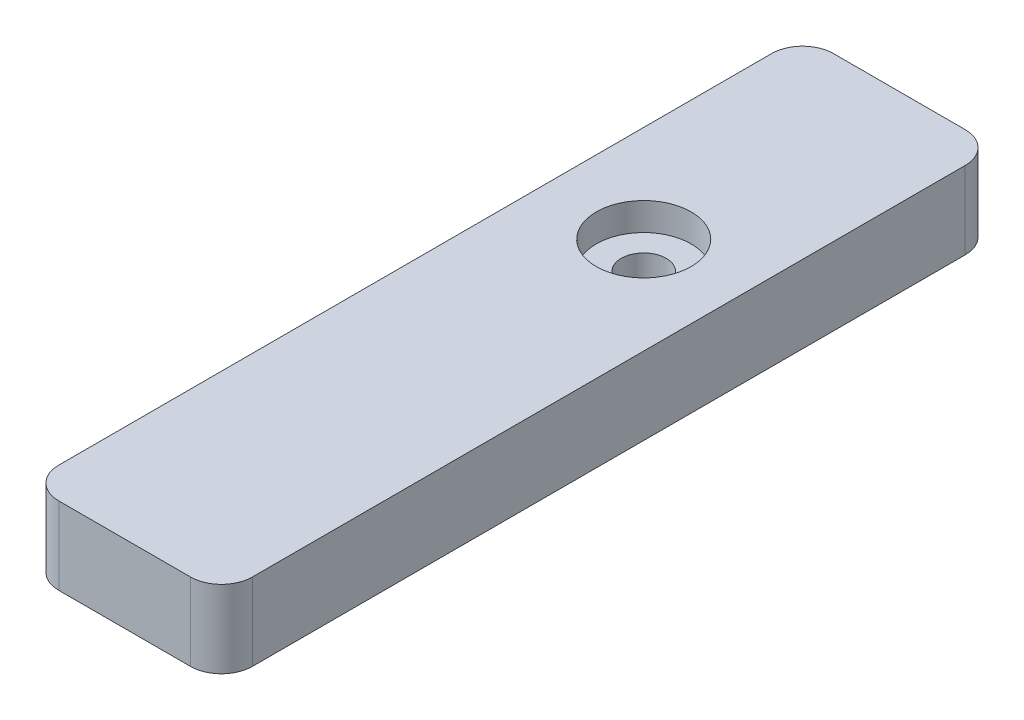
ISO-10303-21;
HEADER;
FILE_DESCRIPTION(('STEP AP214'),'2;1');
FILE_NAME('part.step','',(''),(''),'','','');
FILE_SCHEMA(('AUTOMOTIVE_DESIGN { 1 0 10303 214 1 1 1 1 }'));
ENDSEC;
DATA;
#1=APPLICATION_CONTEXT('core data for automotive mechanical design processes');
#2=APPLICATION_PROTOCOL_DEFINITION('international standard','automotive_design',2000,#1);
#3=PRODUCT_CONTEXT('',#1,'mechanical');
#4=PRODUCT('Part','Part','',(#3));
#5=PRODUCT_RELATED_PRODUCT_CATEGORY('part','',(#4));
#6=PRODUCT_DEFINITION_FORMATION('','',#4);
#7=PRODUCT_DEFINITION_CONTEXT('part definition',#1,'design');
#8=PRODUCT_DEFINITION('design','',#6,#7);
#9=PRODUCT_DEFINITION_SHAPE('','',#8);
#10=(LENGTH_UNIT() NAMED_UNIT(*) SI_UNIT(.MILLI.,.METRE.));
#11=(NAMED_UNIT(*) PLANE_ANGLE_UNIT() SI_UNIT($,.RADIAN.));
#12=(NAMED_UNIT(*) SI_UNIT($,.STERADIAN.) SOLID_ANGLE_UNIT());
#13=UNCERTAINTY_MEASURE_WITH_UNIT(LENGTH_MEASURE(1.E-05),#10,'distance_accuracy_value','');
#14=(GEOMETRIC_REPRESENTATION_CONTEXT(3) GLOBAL_UNCERTAINTY_ASSIGNED_CONTEXT((#13)) GLOBAL_UNIT_ASSIGNED_CONTEXT((#10,
#11,#12)) REPRESENTATION_CONTEXT('',''));
#15=CARTESIAN_POINT('',(0.,0.,0.));
#16=DIRECTION('',(0.,0.,1.));
#17=DIRECTION('',(1.,0.,0.));
#18=AXIS2_PLACEMENT_3D('',#15,#16,#17);
#19=CARTESIAN_POINT('',(0.,10.,0.));
#20=DIRECTION('',(1.,0.,0.));
#21=DIRECTION('',(0.,0.,-1.));
#22=AXIS2_PLACEMENT_3D('',#19,#20,#21);
#23=PLANE('',#22);
#24=DIRECTION('',(0.,0.,1.));
#25=VECTOR('',#24,1.);
#26=CARTESIAN_POINT('',(0.,0.,0.));
#27=LINE('',#26,#25);
#28=CARTESIAN_POINT('',(0.,0.,-96.));
#29=VERTEX_POINT('',#28);
#30=CARTESIAN_POINT('',(0.,0.,-4.));
#31=VERTEX_POINT('',#30);
#32=EDGE_CURVE('E132',#29,#31,#27,.T.);
#33=ORIENTED_EDGE('',*,*,#32,.T.);
#34=DIRECTION('',(0.,-1.,0.));
#35=VECTOR('',#34,1.);
#36=CARTESIAN_POINT('',(0.,10.,-4.));
#37=LINE('',#36,#35);
#38=CARTESIAN_POINT('',(0.,10.,-4.));
#39=VERTEX_POINT('',#38);
#40=EDGE_CURVE('E155',#31,#39,#37,.F.);
#41=ORIENTED_EDGE('',*,*,#40,.T.);
#42=DIRECTION('',(0.,0.,1.));
#43=VECTOR('',#42,1.);
#44=CARTESIAN_POINT('',(0.,10.,0.));
#45=LINE('',#44,#43);
#46=CARTESIAN_POINT('',(0.,10.,-96.));
#47=VERTEX_POINT('',#46);
#48=EDGE_CURVE('E130',#47,#39,#45,.T.);
#49=ORIENTED_EDGE('',*,*,#48,.F.);
#50=DIRECTION('',(0.,-1.,0.));
#51=VECTOR('',#50,1.);
#52=CARTESIAN_POINT('',(0.,10.,-96.));
#53=LINE('',#52,#51);
#54=EDGE_CURVE('E152',#47,#29,#53,.T.);
#55=ORIENTED_EDGE('',*,*,#54,.T.);
#56=EDGE_LOOP('',(#33,#41,#49,#55));
#57=FACE_BOUND('',#56,.T.);
#58=ADVANCED_FACE('F35',(#57),#23,.F.);
#59=CARTESIAN_POINT('',(0.,10.,0.));
#60=DIRECTION('',(0.,0.,-1.));
#61=DIRECTION('',(-1.,0.,0.));
#62=AXIS2_PLACEMENT_3D('',#59,#60,#61);
#63=PLANE('',#62);
#64=DIRECTION('',(1.,0.,0.));
#65=VECTOR('',#64,1.);
#66=CARTESIAN_POINT('',(0.,0.,0.));
#67=LINE('',#66,#65);
#68=CARTESIAN_POINT('',(4.,0.,0.));
#69=VERTEX_POINT('',#68);
#70=CARTESIAN_POINT('',(21.,0.,0.));
#71=VERTEX_POINT('',#70);
#72=EDGE_CURVE('E127',#69,#71,#67,.T.);
#73=ORIENTED_EDGE('',*,*,#72,.T.);
#74=DIRECTION('',(0.,-1.,0.));
#75=VECTOR('',#74,1.);
#76=CARTESIAN_POINT('',(21.,10.,0.));
#77=LINE('',#76,#75);
#78=CARTESIAN_POINT('',(21.,10.,0.));
#79=VERTEX_POINT('',#78);
#80=EDGE_CURVE('E105',#71,#79,#77,.F.);
#81=ORIENTED_EDGE('',*,*,#80,.T.);
#82=DIRECTION('',(1.,0.,0.));
#83=VECTOR('',#82,1.);
#84=CARTESIAN_POINT('',(0.,10.,0.));
#85=LINE('',#84,#83);
#86=CARTESIAN_POINT('',(4.,10.,0.));
#87=VERTEX_POINT('',#86);
#88=EDGE_CURVE('E171',#87,#79,#85,.T.);
#89=ORIENTED_EDGE('',*,*,#88,.F.);
#90=DIRECTION('',(0.,-1.,0.));
#91=VECTOR('',#90,1.);
#92=CARTESIAN_POINT('',(4.,10.,0.));
#93=LINE('',#92,#91);
#94=EDGE_CURVE('E110',#87,#69,#93,.T.);
#95=ORIENTED_EDGE('',*,*,#94,.T.);
#96=EDGE_LOOP('',(#73,#81,#89,#95));
#97=FACE_BOUND('',#96,.T.);
#98=ADVANCED_FACE('F203',(#97),#63,.F.);
#99=CARTESIAN_POINT('',(25.,10.,0.));
#100=DIRECTION('',(-1.,0.,0.));
#101=DIRECTION('',(0.,0.,1.));
#102=AXIS2_PLACEMENT_3D('',#99,#100,#101);
#103=PLANE('',#102);
#104=DIRECTION('',(0.,0.,-1.));
#105=VECTOR('',#104,1.);
#106=CARTESIAN_POINT('',(25.,10.,0.));
#107=LINE('',#106,#105);
#108=CARTESIAN_POINT('',(25.,10.,-4.));
#109=VERTEX_POINT('',#108);
#110=CARTESIAN_POINT('',(25.,10.,-96.));
#111=VERTEX_POINT('',#110);
#112=EDGE_CURVE('E119',#109,#111,#107,.T.);
#113=ORIENTED_EDGE('',*,*,#112,.F.);
#114=DIRECTION('',(0.,-1.,0.));
#115=VECTOR('',#114,1.);
#116=CARTESIAN_POINT('',(25.,10.,-4.));
#117=LINE('',#116,#115);
#118=CARTESIAN_POINT('',(25.,0.,-4.));
#119=VERTEX_POINT('',#118);
#120=EDGE_CURVE('E104',#109,#119,#117,.T.);
#121=ORIENTED_EDGE('',*,*,#120,.T.);
#122=DIRECTION('',(0.,0.,-1.));
#123=VECTOR('',#122,1.);
#124=CARTESIAN_POINT('',(25.,0.,0.));
#125=LINE('',#124,#123);
#126=CARTESIAN_POINT('',(25.,0.,-96.));
#127=VERTEX_POINT('',#126);
#128=EDGE_CURVE('E117',#119,#127,#125,.T.);
#129=ORIENTED_EDGE('',*,*,#128,.T.);
#130=DIRECTION('',(0.,-1.,0.));
#131=VECTOR('',#130,1.);
#132=CARTESIAN_POINT('',(25.,10.,-96.));
#133=LINE('',#132,#131);
#134=EDGE_CURVE('E121',#127,#111,#133,.F.);
#135=ORIENTED_EDGE('',*,*,#134,.T.);
#136=EDGE_LOOP('',(#113,#121,#129,#135));
#137=FACE_BOUND('',#136,.T.);
#138=ADVANCED_FACE('F116',(#137),#103,.F.);
#139=CARTESIAN_POINT('',(0.,10.,-100.));
#140=DIRECTION('',(0.,0.,1.));
#141=DIRECTION('',(1.,0.,0.));
#142=AXIS2_PLACEMENT_3D('',#139,#140,#141);
#143=PLANE('',#142);
#144=DIRECTION('',(-1.,0.,0.));
#145=VECTOR('',#144,1.);
#146=CARTESIAN_POINT('',(0.,0.,-100.));
#147=LINE('',#146,#145);
#148=CARTESIAN_POINT('',(21.,0.,-100.));
#149=VERTEX_POINT('',#148);
#150=CARTESIAN_POINT('',(3.99999999999999,0.,-100.));
#151=VERTEX_POINT('',#150);
#152=EDGE_CURVE('E126',#149,#151,#147,.T.);
#153=ORIENTED_EDGE('',*,*,#152,.T.);
#154=DIRECTION('',(0.,-1.,0.));
#155=VECTOR('',#154,1.);
#156=CARTESIAN_POINT('',(3.99999999999999,10.,-100.));
#157=LINE('',#156,#155);
#158=CARTESIAN_POINT('',(3.99999999999999,10.,-100.));
#159=VERTEX_POINT('',#158);
#160=EDGE_CURVE('E11',#151,#159,#157,.F.);
#161=ORIENTED_EDGE('',*,*,#160,.T.);
#162=DIRECTION('',(-1.,0.,0.));
#163=VECTOR('',#162,1.);
#164=CARTESIAN_POINT('',(0.,10.,-100.));
#165=LINE('',#164,#163);
#166=CARTESIAN_POINT('',(21.,10.,-100.));
#167=VERTEX_POINT('',#166);
#168=EDGE_CURVE('E136',#167,#159,#165,.T.);
#169=ORIENTED_EDGE('',*,*,#168,.F.);
#170=DIRECTION('',(0.,-1.,0.));
#171=VECTOR('',#170,1.);
#172=CARTESIAN_POINT('',(21.,10.,-100.));
#173=LINE('',#172,#171);
#174=EDGE_CURVE('E43',#167,#149,#173,.T.);
#175=ORIENTED_EDGE('',*,*,#174,.T.);
#176=EDGE_LOOP('',(#153,#161,#169,#175));
#177=FACE_BOUND('',#176,.T.);
#178=ADVANCED_FACE('F158',(#177),#143,.F.);
#179=CARTESIAN_POINT('',(0.,10.,0.));
#180=DIRECTION('',(0.,-1.,0.));
#181=DIRECTION('',(0.,0.,-1.));
#182=AXIS2_PLACEMENT_3D('',#179,#180,#181);
#183=PLANE('',#182);
#184=CARTESIAN_POINT('',(12.5,10.,-67.));
#185=DIRECTION('',(0.,1.,0.));
#186=DIRECTION('',(0.,0.,1.));
#187=AXIS2_PLACEMENT_3D('',#184,#185,#186);
#188=CIRCLE('',#187,6.12);
#189=CARTESIAN_POINT('',(12.5,10.,-60.88));
#190=VERTEX_POINT('',#189);
#191=EDGE_CURVE('E189',#190,#190,#188,.T.);
#192=ORIENTED_EDGE('',*,*,#191,.F.);
#193=EDGE_LOOP('',(#192));
#194=FACE_BOUND('',#193,.T.);
#195=ORIENTED_EDGE('',*,*,#88,.T.);
#196=CARTESIAN_POINT('',(21.,10.,-4.));
#197=DIRECTION('',(0.,-1.,0.));
#198=DIRECTION('',(0.,0.,-1.));
#199=AXIS2_PLACEMENT_3D('',#196,#197,#198);
#200=CIRCLE('',#199,4.);
#201=EDGE_CURVE('E150',#79,#109,#200,.F.);
#202=ORIENTED_EDGE('',*,*,#201,.T.);
#203=ORIENTED_EDGE('',*,*,#112,.T.);
#204=CARTESIAN_POINT('',(21.,10.,-96.));
#205=DIRECTION('',(0.,-1.,0.));
#206=DIRECTION('',(0.,0.,-1.));
#207=AXIS2_PLACEMENT_3D('',#204,#205,#206);
#208=CIRCLE('',#207,4.);
#209=EDGE_CURVE('E55',#111,#167,#208,.F.);
#210=ORIENTED_EDGE('',*,*,#209,.T.);
#211=ORIENTED_EDGE('',*,*,#168,.T.);
#212=CARTESIAN_POINT('',(3.99999999999999,10.,-96.));
#213=DIRECTION('',(0.,-1.,0.));
#214=DIRECTION('',(0.,0.,-1.));
#215=AXIS2_PLACEMENT_3D('',#212,#213,#214);
#216=CIRCLE('',#215,4.);
#217=EDGE_CURVE('E146',#159,#47,#216,.F.);
#218=ORIENTED_EDGE('',*,*,#217,.T.);
#219=ORIENTED_EDGE('',*,*,#48,.T.);
#220=CARTESIAN_POINT('',(4.,10.,-4.));
#221=DIRECTION('',(0.,-1.,0.));
#222=DIRECTION('',(0.,0.,-1.));
#223=AXIS2_PLACEMENT_3D('',#220,#221,#222);
#224=CIRCLE('',#223,4.);
#225=EDGE_CURVE('E148',#39,#87,#224,.F.);
#226=ORIENTED_EDGE('',*,*,#225,.T.);
#227=EDGE_LOOP('',(#195,#202,#203,#210,#211,#218,#219,#226));
#228=FACE_BOUND('',#227,.T.);
#229=ADVANCED_FACE('F197',(#194,#228),#183,.F.);
#230=CARTESIAN_POINT('',(0.,0.,0.));
#231=DIRECTION('',(0.,-1.,0.));
#232=DIRECTION('',(0.,0.,-1.));
#233=AXIS2_PLACEMENT_3D('',#230,#231,#232);
#234=PLANE('',#233);
#235=CARTESIAN_POINT('',(12.5,0.,-67.));
#236=DIRECTION('',(0.,1.,0.));
#237=DIRECTION('',(0.,0.,1.));
#238=AXIS2_PLACEMENT_3D('',#235,#236,#237);
#239=CIRCLE('',#238,2.9);
#240=CARTESIAN_POINT('',(12.5,0.,-64.1));
#241=VERTEX_POINT('',#240);
#242=EDGE_CURVE('E176',#241,#241,#239,.T.);
#243=ORIENTED_EDGE('',*,*,#242,.T.);
#244=EDGE_LOOP('',(#243));
#245=FACE_BOUND('',#244,.T.);
#246=ORIENTED_EDGE('',*,*,#128,.F.);
#247=CARTESIAN_POINT('',(21.,0.,-4.));
#248=DIRECTION('',(0.,-1.,0.));
#249=DIRECTION('',(0.,0.,-1.));
#250=AXIS2_PLACEMENT_3D('',#247,#248,#249);
#251=CIRCLE('',#250,4.);
#252=EDGE_CURVE('E100',#119,#71,#251,.T.);
#253=ORIENTED_EDGE('',*,*,#252,.T.);
#254=ORIENTED_EDGE('',*,*,#72,.F.);
#255=CARTESIAN_POINT('',(4.,0.,-4.));
#256=DIRECTION('',(0.,-1.,0.));
#257=DIRECTION('',(0.,0.,-1.));
#258=AXIS2_PLACEMENT_3D('',#255,#256,#257);
#259=CIRCLE('',#258,4.);
#260=EDGE_CURVE('E111',#69,#31,#259,.T.);
#261=ORIENTED_EDGE('',*,*,#260,.T.);
#262=ORIENTED_EDGE('',*,*,#32,.F.);
#263=CARTESIAN_POINT('',(3.99999999999999,0.,-96.));
#264=DIRECTION('',(0.,-1.,0.));
#265=DIRECTION('',(0.,0.,-1.));
#266=AXIS2_PLACEMENT_3D('',#263,#264,#265);
#267=CIRCLE('',#266,4.);
#268=EDGE_CURVE('E139',#29,#151,#267,.T.);
#269=ORIENTED_EDGE('',*,*,#268,.T.);
#270=ORIENTED_EDGE('',*,*,#152,.F.);
#271=CARTESIAN_POINT('',(21.,0.,-96.));
#272=DIRECTION('',(0.,-1.,0.));
#273=DIRECTION('',(0.,0.,-1.));
#274=AXIS2_PLACEMENT_3D('',#271,#272,#273);
#275=CIRCLE('',#274,4.);
#276=EDGE_CURVE('E120',#149,#127,#275,.T.);
#277=ORIENTED_EDGE('',*,*,#276,.T.);
#278=EDGE_LOOP('',(#246,#253,#254,#261,#262,#269,#270,#277));
#279=FACE_BOUND('',#278,.T.);
#280=ADVANCED_FACE('F123',(#245,#279),#234,.T.);
#281=CARTESIAN_POINT('',(12.5,10.,-67.));
#282=DIRECTION('',(0.,1.,0.));
#283=DIRECTION('',(0.,0.,1.));
#284=AXIS2_PLACEMENT_3D('',#281,#282,#283);
#285=CYLINDRICAL_SURFACE('',#284,2.9);
#286=ORIENTED_EDGE('',*,*,#242,.F.);
#287=EDGE_LOOP('',(#286));
#288=FACE_BOUND('',#287,.T.);
#289=CARTESIAN_POINT('',(12.5,6.42,-67.));
#290=DIRECTION('',(0.,1.,0.));
#291=DIRECTION('',(0.,0.,1.));
#292=AXIS2_PLACEMENT_3D('',#289,#290,#291);
#293=CIRCLE('',#292,2.9);
#294=CARTESIAN_POINT('',(12.5,6.42,-64.1));
#295=VERTEX_POINT('',#294);
#296=EDGE_CURVE('E181',#295,#295,#293,.T.);
#297=ORIENTED_EDGE('',*,*,#296,.T.);
#298=EDGE_LOOP('',(#297));
#299=FACE_BOUND('',#298,.T.);
#300=ADVANCED_FACE('F225',(#288,#299),#285,.F.);
#301=CARTESIAN_POINT('',(15.4,6.42,-67.));
#302=DIRECTION('',(0.,-1.,0.));
#303=DIRECTION('',(0.,0.,-1.));
#304=AXIS2_PLACEMENT_3D('',#301,#302,#303);
#305=PLANE('',#304);
#306=ORIENTED_EDGE('',*,*,#296,.F.);
#307=EDGE_LOOP('',(#306));
#308=FACE_BOUND('',#307,.T.);
#309=CARTESIAN_POINT('',(12.5,6.42,-67.));
#310=DIRECTION('',(0.,1.,0.));
#311=DIRECTION('',(0.,0.,1.));
#312=AXIS2_PLACEMENT_3D('',#309,#310,#311);
#313=CIRCLE('',#312,6.12);
#314=CARTESIAN_POINT('',(12.5,6.42,-60.88));
#315=VERTEX_POINT('',#314);
#316=EDGE_CURVE('E185',#315,#315,#313,.T.);
#317=ORIENTED_EDGE('',*,*,#316,.T.);
#318=EDGE_LOOP('',(#317));
#319=FACE_BOUND('',#318,.T.);
#320=ADVANCED_FACE('F229',(#308,#319),#305,.F.);
#321=CARTESIAN_POINT('',(12.5,10.,-67.));
#322=DIRECTION('',(0.,1.,0.));
#323=DIRECTION('',(0.,0.,1.));
#324=AXIS2_PLACEMENT_3D('',#321,#322,#323);
#325=CYLINDRICAL_SURFACE('',#324,6.12);
#326=ORIENTED_EDGE('',*,*,#316,.F.);
#327=EDGE_LOOP('',(#326));
#328=FACE_BOUND('',#327,.T.);
#329=ORIENTED_EDGE('',*,*,#191,.T.);
#330=EDGE_LOOP('',(#329));
#331=FACE_BOUND('',#330,.T.);
#332=ADVANCED_FACE('F195',(#328,#331),#325,.F.);
#333=CARTESIAN_POINT('',(21.,10.,-4.));
#334=DIRECTION('',(0.,-1.,0.));
#335=DIRECTION('',(0.,0.,-1.));
#336=AXIS2_PLACEMENT_3D('',#333,#334,#335);
#337=CYLINDRICAL_SURFACE('',#336,4.);
#338=ORIENTED_EDGE('',*,*,#201,.F.);
#339=ORIENTED_EDGE('',*,*,#80,.F.);
#340=ORIENTED_EDGE('',*,*,#252,.F.);
#341=ORIENTED_EDGE('',*,*,#120,.F.);
#342=EDGE_LOOP('',(#338,#339,#340,#341));
#343=FACE_BOUND('',#342,.T.);
#344=ADVANCED_FACE('F103',(#343),#337,.T.);
#345=CARTESIAN_POINT('',(4.,10.,-4.));
#346=DIRECTION('',(0.,-1.,0.));
#347=DIRECTION('',(0.,0.,-1.));
#348=AXIS2_PLACEMENT_3D('',#345,#346,#347);
#349=CYLINDRICAL_SURFACE('',#348,4.);
#350=ORIENTED_EDGE('',*,*,#225,.F.);
#351=ORIENTED_EDGE('',*,*,#40,.F.);
#352=ORIENTED_EDGE('',*,*,#260,.F.);
#353=ORIENTED_EDGE('',*,*,#94,.F.);
#354=EDGE_LOOP('',(#350,#351,#352,#353));
#355=FACE_BOUND('',#354,.T.);
#356=ADVANCED_FACE('F205',(#355),#349,.T.);
#357=CARTESIAN_POINT('',(3.99999999999999,10.,-96.));
#358=DIRECTION('',(0.,-1.,0.));
#359=DIRECTION('',(0.,0.,-1.));
#360=AXIS2_PLACEMENT_3D('',#357,#358,#359);
#361=CYLINDRICAL_SURFACE('',#360,4.);
#362=ORIENTED_EDGE('',*,*,#217,.F.);
#363=ORIENTED_EDGE('',*,*,#160,.F.);
#364=ORIENTED_EDGE('',*,*,#268,.F.);
#365=ORIENTED_EDGE('',*,*,#54,.F.);
#366=EDGE_LOOP('',(#362,#363,#364,#365));
#367=FACE_BOUND('',#366,.T.);
#368=ADVANCED_FACE('F165',(#367),#361,.T.);
#369=CARTESIAN_POINT('',(21.,10.,-96.));
#370=DIRECTION('',(0.,-1.,0.));
#371=DIRECTION('',(0.,0.,-1.));
#372=AXIS2_PLACEMENT_3D('',#369,#370,#371);
#373=CYLINDRICAL_SURFACE('',#372,4.);
#374=ORIENTED_EDGE('',*,*,#209,.F.);
#375=ORIENTED_EDGE('',*,*,#134,.F.);
#376=ORIENTED_EDGE('',*,*,#276,.F.);
#377=ORIENTED_EDGE('',*,*,#174,.F.);
#378=EDGE_LOOP('',(#374,#375,#376,#377));
#379=FACE_BOUND('',#378,.T.);
#380=ADVANCED_FACE('F37',(#379),#373,.T.);
#381=CLOSED_SHELL('',(#58,#98,#138,#178,#229,#280,#300,#320,#332,#344,#356,#368,#380));
#382=MANIFOLD_SOLID_BREP('B2',#381);
#383=ADVANCED_BREP_SHAPE_REPRESENTATION('',(#18,#382),#14);
#384=SHAPE_DEFINITION_REPRESENTATION(#9,#383);
ENDSEC;
END-ISO-10303-21;
